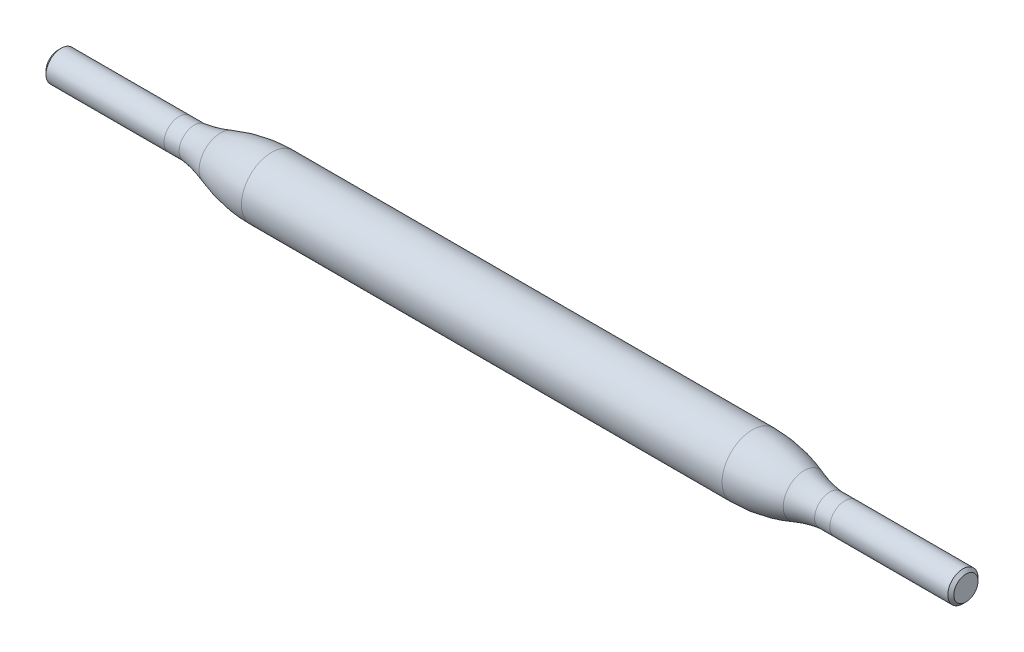
ISO-10303-21;
HEADER;
FILE_DESCRIPTION(('STEP AP214'),'2;1');
FILE_NAME('part.step','',(''),(''),'','','');
FILE_SCHEMA(('AUTOMOTIVE_DESIGN { 1 0 10303 214 1 1 1 1 }'));
ENDSEC;
DATA;
#1=APPLICATION_CONTEXT('core data for automotive mechanical design processes');
#2=APPLICATION_PROTOCOL_DEFINITION('international standard','automotive_design',2000,#1);
#3=PRODUCT_CONTEXT('',#1,'mechanical');
#4=PRODUCT('Part','Part','',(#3));
#5=PRODUCT_RELATED_PRODUCT_CATEGORY('part','',(#4));
#6=PRODUCT_DEFINITION_FORMATION('','',#4);
#7=PRODUCT_DEFINITION_CONTEXT('part definition',#1,'design');
#8=PRODUCT_DEFINITION('design','',#6,#7);
#9=PRODUCT_DEFINITION_SHAPE('','',#8);
#10=(LENGTH_UNIT() NAMED_UNIT(*) SI_UNIT(.MILLI.,.METRE.));
#11=(NAMED_UNIT(*) PLANE_ANGLE_UNIT() SI_UNIT($,.RADIAN.));
#12=(NAMED_UNIT(*) SI_UNIT($,.STERADIAN.) SOLID_ANGLE_UNIT());
#13=UNCERTAINTY_MEASURE_WITH_UNIT(LENGTH_MEASURE(1.E-05),#10,'distance_accuracy_value','');
#14=(GEOMETRIC_REPRESENTATION_CONTEXT(3) GLOBAL_UNCERTAINTY_ASSIGNED_CONTEXT((#13)) GLOBAL_UNIT_ASSIGNED_CONTEXT((#10,
#11,#12)) REPRESENTATION_CONTEXT('',''));
#15=CARTESIAN_POINT('',(0.,0.,0.));
#16=DIRECTION('',(0.,0.,1.));
#17=DIRECTION('',(1.,0.,0.));
#18=AXIS2_PLACEMENT_3D('',#15,#16,#17);
#19=CARTESIAN_POINT('',(-30.,0.,0.));
#20=DIRECTION('',(-1.,0.,0.));
#21=DIRECTION('',(0.,-1.,0.));
#22=AXIS2_PLACEMENT_3D('',#19,#20,#21);
#23=CYLINDRICAL_SURFACE('',#22,1.00000000000001);
#24=CARTESIAN_POINT('',(21.,0.,0.));
#25=DIRECTION('',(-1.,0.,0.));
#26=DIRECTION('',(0.,-1.,0.));
#27=AXIS2_PLACEMENT_3D('',#24,#25,#26);
#28=CIRCLE('',#27,1.);
#29=CARTESIAN_POINT('',(21.,-1.,0.));
#30=VERTEX_POINT('',#29);
#31=EDGE_CURVE('E66',#30,#30,#28,.T.);
#32=ORIENTED_EDGE('',*,*,#31,.F.);
#33=EDGE_LOOP('',(#32));
#34=FACE_BOUND('',#33,.T.);
#35=CARTESIAN_POINT('',(22.,0.,0.));
#36=DIRECTION('',(1.,0.,0.));
#37=DIRECTION('',(0.,0.,-1.));
#38=AXIS2_PLACEMENT_3D('',#35,#36,#37);
#39=CIRCLE('',#38,1.00000000000001);
#40=CARTESIAN_POINT('',(22.,0.,-1.00000000000001));
#41=VERTEX_POINT('',#40);
#42=EDGE_CURVE('E58',#41,#41,#39,.T.);
#43=ORIENTED_EDGE('',*,*,#42,.F.);
#44=EDGE_LOOP('',(#43));
#45=FACE_BOUND('',#44,.T.);
#46=ADVANCED_FACE('F37',(#34,#45),#23,.T.);
#47=CARTESIAN_POINT('',(-30.,0.,0.));
#48=DIRECTION('',(-1.,0.,0.));
#49=DIRECTION('',(0.,-1.,0.));
#50=AXIS2_PLACEMENT_3D('',#47,#48,#49);
#51=CYLINDRICAL_SURFACE('',#50,1.00000000000001);
#52=CARTESIAN_POINT('',(-29.8,0.,0.));
#53=DIRECTION('',(1.,0.,0.));
#54=DIRECTION('',(0.,1.,0.));
#55=AXIS2_PLACEMENT_3D('',#52,#53,#54);
#56=CIRCLE('',#55,1.00000000000001);
#57=CARTESIAN_POINT('',(-29.8,1.,0.));
#58=VERTEX_POINT('',#57);
#59=EDGE_CURVE('E49',#58,#58,#56,.T.);
#60=ORIENTED_EDGE('',*,*,#59,.T.);
#61=EDGE_LOOP('',(#60));
#62=FACE_BOUND('',#61,.T.);
#63=CARTESIAN_POINT('',(-22.,0.,0.));
#64=DIRECTION('',(1.,0.,0.));
#65=DIRECTION('',(0.,0.,-1.));
#66=AXIS2_PLACEMENT_3D('',#63,#64,#65);
#67=CIRCLE('',#66,1.00000000000001);
#68=CARTESIAN_POINT('',(-22.,0.,-1.00000000000001));
#69=VERTEX_POINT('',#68);
#70=EDGE_CURVE('E62',#69,#69,#67,.T.);
#71=ORIENTED_EDGE('',*,*,#70,.F.);
#72=EDGE_LOOP('',(#71));
#73=FACE_BOUND('',#72,.T.);
#74=ADVANCED_FACE('F120',(#62,#73),#51,.T.);
#75=CARTESIAN_POINT('',(-30.,0.,0.));
#76=DIRECTION('',(1.,0.,0.));
#77=DIRECTION('',(0.,1.,0.));
#78=AXIS2_PLACEMENT_3D('',#75,#76,#77);
#79=PLANE('',#78);
#80=CARTESIAN_POINT('',(-30.,0.,0.));
#81=DIRECTION('',(1.,0.,0.));
#82=DIRECTION('',(0.,1.,0.));
#83=AXIS2_PLACEMENT_3D('',#80,#81,#82);
#84=CIRCLE('',#83,0.800000000000023);
#85=CARTESIAN_POINT('',(-30.,0.800000000000012,0.));
#86=VERTEX_POINT('',#85);
#87=EDGE_CURVE('E53',#86,#86,#84,.F.);
#88=ORIENTED_EDGE('',*,*,#87,.T.);
#89=EDGE_LOOP('',(#88));
#90=FACE_BOUND('',#89,.T.);
#91=ADVANCED_FACE('F129',(#90),#79,.F.);
#92=CARTESIAN_POINT('',(30.,0.,0.));
#93=DIRECTION('',(-1.,0.,0.));
#94=DIRECTION('',(0.,-1.,0.));
#95=AXIS2_PLACEMENT_3D('',#92,#93,#94);
#96=PLANE('',#95);
#97=CARTESIAN_POINT('',(30.,0.,0.));
#98=DIRECTION('',(-1.,0.,0.));
#99=DIRECTION('',(0.,-1.,0.));
#100=AXIS2_PLACEMENT_3D('',#97,#98,#99);
#101=CIRCLE('',#100,0.800000000000002);
#102=CARTESIAN_POINT('',(30.,-0.800000000000002,0.));
#103=VERTEX_POINT('',#102);
#104=EDGE_CURVE('E10',#103,#103,#101,.F.);
#105=ORIENTED_EDGE('',*,*,#104,.T.);
#106=EDGE_LOOP('',(#105));
#107=FACE_BOUND('',#106,.T.);
#108=ADVANCED_FACE('F125',(#107),#96,.F.);
#109=CARTESIAN_POINT('',(29.8,0.,0.));
#110=DIRECTION('',(-1.,0.,0.));
#111=DIRECTION('',(0.,-1.,0.));
#112=AXIS2_PLACEMENT_3D('',#109,#110,#111);
#113=CIRCLE('',#112,1.00000000000001);
#114=CARTESIAN_POINT('',(29.8,-1.00000000000001,0.));
#115=VERTEX_POINT('',#114);
#116=EDGE_CURVE('E45',#115,#115,#113,.T.);
#117=ORIENTED_EDGE('',*,*,#116,.T.);
#118=EDGE_LOOP('',(#117));
#119=FACE_BOUND('',#118,.T.);
#120=ORIENTED_EDGE('',*,*,#42,.T.);
#121=EDGE_LOOP('',(#120));
#122=FACE_BOUND('',#121,.T.);
#123=ADVANCED_FACE('F114',(#119,#122),#23,.T.);
#124=CARTESIAN_POINT('',(21.7673565621716,0.,0.));
#125=DIRECTION('',(-1.,0.,0.));
#126=DIRECTION('',(0.,-1.,0.));
#127=AXIS2_PLACEMENT_3D('',#124,#125,#126);
#128=TOROIDAL_SURFACE('',#127,8.09678203517459,7.13814761323165);
#129=CARTESIAN_POINT('',(19.3170487959504,0.,0.));
#130=DIRECTION('',(-1.,0.,0.));
#131=DIRECTION('',(0.,-1.,0.));
#132=AXIS2_PLACEMENT_3D('',#129,#130,#131);
#133=CIRCLE('',#132,1.39236981641292);
#134=CARTESIAN_POINT('',(19.3170487959504,-1.39236981641292,0.));
#135=VERTEX_POINT('',#134);
#136=EDGE_CURVE('E69',#135,#135,#133,.T.);
#137=ORIENTED_EDGE('',*,*,#136,.F.);
#138=EDGE_LOOP('',(#137));
#139=FACE_BOUND('',#138,.T.);
#140=ORIENTED_EDGE('',*,*,#31,.T.);
#141=EDGE_LOOP('',(#140));
#142=FACE_BOUND('',#141,.T.);
#143=ADVANCED_FACE('F108',(#139,#142),#128,.F.);
#144=CARTESIAN_POINT('',(15.8843546307595,0.,0.));
#145=DIRECTION('',(-1.,0.,0.));
#146=DIRECTION('',(0.,-1.,0.));
#147=AXIS2_PLACEMENT_3D('',#144,#145,#146);
#148=DEGENERATE_TOROIDAL_SURFACE('',#147,8.,10.,.F.);
#149=CARTESIAN_POINT('',(15.8843546307595,0.,0.));
#150=DIRECTION('',(-1.,0.,0.));
#151=DIRECTION('',(0.,-1.,0.));
#152=AXIS2_PLACEMENT_3D('',#149,#150,#151);
#153=CIRCLE('',#152,2.);
#154=CARTESIAN_POINT('',(15.8843546307595,-2.00000000000001,0.));
#155=VERTEX_POINT('',#154);
#156=EDGE_CURVE('E72',#155,#155,#153,.T.);
#157=ORIENTED_EDGE('',*,*,#156,.F.);
#158=EDGE_LOOP('',(#157));
#159=FACE_BOUND('',#158,.T.);
#160=ORIENTED_EDGE('',*,*,#136,.T.);
#161=EDGE_LOOP('',(#160));
#162=FACE_BOUND('',#161,.T.);
#163=ADVANCED_FACE('F102',(#159,#162),#148,.F.);
#164=CARTESIAN_POINT('',(-30.,0.,0.));
#165=DIRECTION('',(-1.,0.,0.));
#166=DIRECTION('',(0.,-1.,0.));
#167=AXIS2_PLACEMENT_3D('',#164,#165,#166);
#168=CYLINDRICAL_SURFACE('',#167,2.00000000000001);
#169=CARTESIAN_POINT('',(-15.8843546307596,0.,0.));
#170=DIRECTION('',(-1.,0.,0.));
#171=DIRECTION('',(0.,-1.,0.));
#172=AXIS2_PLACEMENT_3D('',#169,#170,#171);
#173=CIRCLE('',#172,2.00000000000001);
#174=CARTESIAN_POINT('',(-15.8843546307596,-2.00000000000002,0.));
#175=VERTEX_POINT('',#174);
#176=EDGE_CURVE('E75',#175,#175,#173,.T.);
#177=ORIENTED_EDGE('',*,*,#176,.F.);
#178=EDGE_LOOP('',(#177));
#179=FACE_BOUND('',#178,.T.);
#180=ORIENTED_EDGE('',*,*,#156,.T.);
#181=EDGE_LOOP('',(#180));
#182=FACE_BOUND('',#181,.T.);
#183=ADVANCED_FACE('F96',(#179,#182),#168,.T.);
#184=CARTESIAN_POINT('',(-15.8843546307596,0.,0.));
#185=DIRECTION('',(-1.,0.,0.));
#186=DIRECTION('',(0.,-1.,0.));
#187=AXIS2_PLACEMENT_3D('',#184,#185,#186);
#188=DEGENERATE_TOROIDAL_SURFACE('',#187,7.99999999999999,10.,.F.);
#189=CARTESIAN_POINT('',(-19.2721424743445,0.,0.));
#190=DIRECTION('',(-1.,0.,0.));
#191=DIRECTION('',(0.,-1.,0.));
#192=AXIS2_PLACEMENT_3D('',#189,#190,#191);
#193=CIRCLE('',#192,1.4086605596577);
#194=CARTESIAN_POINT('',(-19.2721424743445,-1.40866055965771,0.));
#195=VERTEX_POINT('',#194);
#196=EDGE_CURVE('E78',#195,#195,#193,.T.);
#197=ORIENTED_EDGE('',*,*,#196,.F.);
#198=EDGE_LOOP('',(#197));
#199=FACE_BOUND('',#198,.T.);
#200=ORIENTED_EDGE('',*,*,#176,.T.);
#201=EDGE_LOOP('',(#200));
#202=FACE_BOUND('',#201,.T.);
#203=ADVANCED_FACE('F90',(#199,#202),#188,.F.);
#204=CARTESIAN_POINT('',(-21.9306191170261,0.,0.));
#205=DIRECTION('',(-1.,0.,0.));
#206=DIRECTION('',(0.,-1.,0.));
#207=AXIS2_PLACEMENT_3D('',#204,#205,#206);
#208=TOROIDAL_SURFACE('',#207,8.79185735107839,7.84723473081624);
#209=CARTESIAN_POINT('',(-21.,0.,0.));
#210=DIRECTION('',(-1.,0.,0.));
#211=DIRECTION('',(0.,-1.,0.));
#212=AXIS2_PLACEMENT_3D('',#209,#210,#211);
#213=CIRCLE('',#212,1.00000000000001);
#214=CARTESIAN_POINT('',(-21.,-1.00000000000002,0.));
#215=VERTEX_POINT('',#214);
#216=EDGE_CURVE('E81',#215,#215,#213,.T.);
#217=ORIENTED_EDGE('',*,*,#216,.F.);
#218=EDGE_LOOP('',(#217));
#219=FACE_BOUND('',#218,.T.);
#220=ORIENTED_EDGE('',*,*,#196,.T.);
#221=EDGE_LOOP('',(#220));
#222=FACE_BOUND('',#221,.T.);
#223=ADVANCED_FACE('F87',(#219,#222),#208,.F.);
#224=ORIENTED_EDGE('',*,*,#70,.T.);
#225=EDGE_LOOP('',(#224));
#226=FACE_BOUND('',#225,.T.);
#227=ORIENTED_EDGE('',*,*,#216,.T.);
#228=EDGE_LOOP('',(#227));
#229=FACE_BOUND('',#228,.T.);
#230=ADVANCED_FACE('F85',(#226,#229),#51,.T.);
#231=CARTESIAN_POINT('',(-30.,0.,0.));
#232=DIRECTION('',(1.,0.,0.));
#233=DIRECTION('',(0.,1.,0.));
#234=AXIS2_PLACEMENT_3D('',#231,#232,#233);
#235=CONICAL_SURFACE('',#234,0.800000000000023,0.785398163397455);
#236=ORIENTED_EDGE('',*,*,#59,.F.);
#237=EDGE_LOOP('',(#236));
#238=FACE_BOUND('',#237,.T.);
#239=ORIENTED_EDGE('',*,*,#87,.F.);
#240=EDGE_LOOP('',(#239));
#241=FACE_BOUND('',#240,.T.);
#242=ADVANCED_FACE('F135',(#238,#241),#235,.T.);
#243=CARTESIAN_POINT('',(29.8,0.,0.));
#244=DIRECTION('',(-1.,0.,0.));
#245=DIRECTION('',(0.,-1.,0.));
#246=AXIS2_PLACEMENT_3D('',#243,#244,#245);
#247=CONICAL_SURFACE('',#246,1.00000000000001,0.785398163397462);
#248=ORIENTED_EDGE('',*,*,#104,.F.);
#249=EDGE_LOOP('',(#248));
#250=FACE_BOUND('',#249,.T.);
#251=ORIENTED_EDGE('',*,*,#116,.F.);
#252=EDGE_LOOP('',(#251));
#253=FACE_BOUND('',#252,.T.);
#254=ADVANCED_FACE('F40',(#250,#253),#247,.T.);
#255=CLOSED_SHELL('',(#46,#74,#91,#108,#123,#143,#163,#183,#203,#223,#230,#242,#254));
#256=MANIFOLD_SOLID_BREP('B2',#255);
#257=ADVANCED_BREP_SHAPE_REPRESENTATION('',(#18,#256),#14);
#258=SHAPE_DEFINITION_REPRESENTATION(#9,#257);
ENDSEC;
END-ISO-10303-21;
